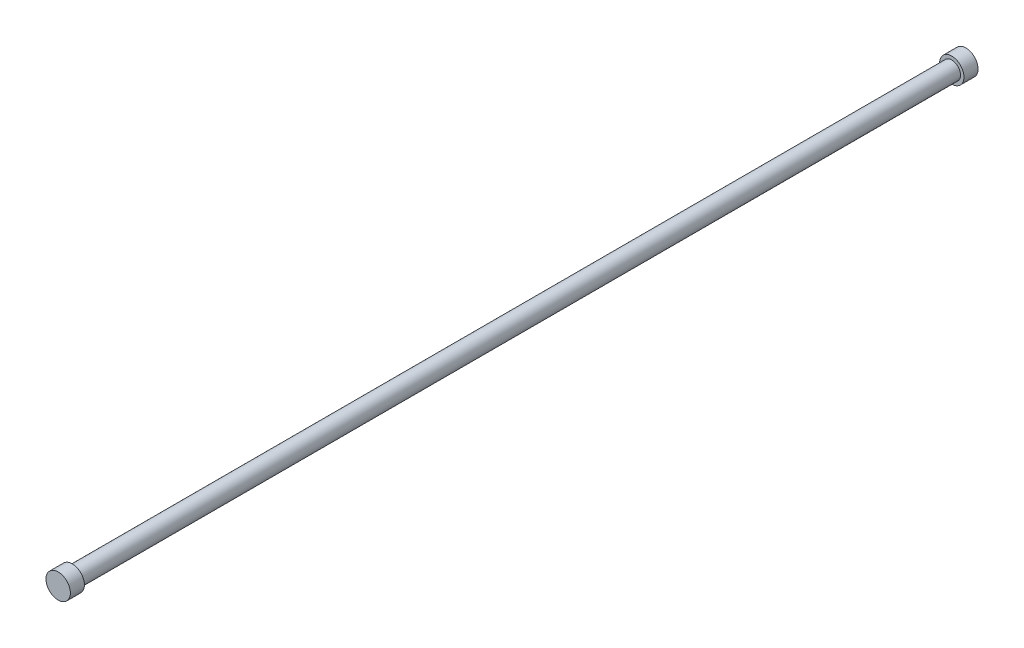
ISO-10303-21;
HEADER;
FILE_DESCRIPTION(('STEP AP214'),'2;1');
FILE_NAME('part.step','',(''),(''),'','','');
FILE_SCHEMA(('AUTOMOTIVE_DESIGN { 1 0 10303 214 1 1 1 1 }'));
ENDSEC;
DATA;
#1=APPLICATION_CONTEXT('core data for automotive mechanical design processes');
#2=APPLICATION_PROTOCOL_DEFINITION('international standard','automotive_design',2000,#1);
#3=PRODUCT_CONTEXT('',#1,'mechanical');
#4=PRODUCT('Part','Part','',(#3));
#5=PRODUCT_RELATED_PRODUCT_CATEGORY('part','',(#4));
#6=PRODUCT_DEFINITION_FORMATION('','',#4);
#7=PRODUCT_DEFINITION_CONTEXT('part definition',#1,'design');
#8=PRODUCT_DEFINITION('design','',#6,#7);
#9=PRODUCT_DEFINITION_SHAPE('','',#8);
#10=(LENGTH_UNIT() NAMED_UNIT(*) SI_UNIT(.MILLI.,.METRE.));
#11=(NAMED_UNIT(*) PLANE_ANGLE_UNIT() SI_UNIT($,.RADIAN.));
#12=(NAMED_UNIT(*) SI_UNIT($,.STERADIAN.) SOLID_ANGLE_UNIT());
#13=UNCERTAINTY_MEASURE_WITH_UNIT(LENGTH_MEASURE(1.E-05),#10,'distance_accuracy_value','');
#14=(GEOMETRIC_REPRESENTATION_CONTEXT(3) GLOBAL_UNCERTAINTY_ASSIGNED_CONTEXT((#13)) GLOBAL_UNIT_ASSIGNED_CONTEXT((#10,
#11,#12)) REPRESENTATION_CONTEXT('',''));
#15=CARTESIAN_POINT('',(0.,0.,0.));
#16=DIRECTION('',(0.,0.,1.));
#17=DIRECTION('',(1.,0.,0.));
#18=AXIS2_PLACEMENT_3D('',#15,#16,#17);
#19=CARTESIAN_POINT('',(0.,0.,317.5));
#20=DIRECTION('',(0.,0.,-1.));
#21=DIRECTION('',(-1.,0.,0.));
#22=AXIS2_PLACEMENT_3D('',#19,#20,#21);
#23=CYLINDRICAL_SURFACE('',#22,3.175);
#24=CARTESIAN_POINT('',(0.,0.,317.5));
#25=DIRECTION('',(0.,0.,1.));
#26=DIRECTION('',(1.,0.,0.));
#27=AXIS2_PLACEMENT_3D('',#24,#25,#26);
#28=CIRCLE('',#27,3.175);
#29=CARTESIAN_POINT('',(-3.175,0.,317.5));
#30=VERTEX_POINT('',#29);
#31=EDGE_CURVE('E10',#30,#30,#28,.T.);
#32=CARTESIAN_POINT('',(0.,0.,0.));
#33=DIRECTION('',(0.,0.,1.));
#34=DIRECTION('',(1.,0.,0.));
#35=AXIS2_PLACEMENT_3D('',#32,#33,#34);
#36=CIRCLE('',#35,3.175);
#37=CARTESIAN_POINT('',(-3.175,0.,0.));
#38=VERTEX_POINT('',#37);
#39=EDGE_CURVE('E46',#38,#38,#36,.T.);
#40=CARTESIAN_POINT('',(-3.175,0.,317.5));
#41=CARTESIAN_POINT('',(-3.175,0.,314.192708333333));
#42=CARTESIAN_POINT('',(-3.175,0.,310.885416666667));
#43=CARTESIAN_POINT('',(-3.175,0.,304.270833333333));
#44=CARTESIAN_POINT('',(-3.175,0.,300.963541666667));
#45=CARTESIAN_POINT('',(-3.175,0.,294.348958333333));
#46=CARTESIAN_POINT('',(-3.175,0.,291.041666666667));
#47=CARTESIAN_POINT('',(-3.175,0.,284.427083333333));
#48=CARTESIAN_POINT('',(-3.175,0.,281.119791666667));
#49=CARTESIAN_POINT('',(-3.175,0.,274.505208333333));
#50=CARTESIAN_POINT('',(-3.175,0.,271.197916666667));
#51=CARTESIAN_POINT('',(-3.175,0.,264.583333333333));
#52=CARTESIAN_POINT('',(-3.175,0.,261.276041666667));
#53=CARTESIAN_POINT('',(-3.175,0.,254.661458333333));
#54=CARTESIAN_POINT('',(-3.175,0.,251.354166666667));
#55=CARTESIAN_POINT('',(-3.175,0.,244.739583333333));
#56=CARTESIAN_POINT('',(-3.175,0.,241.432291666667));
#57=CARTESIAN_POINT('',(-3.175,0.,234.817708333333));
#58=CARTESIAN_POINT('',(-3.175,0.,231.510416666667));
#59=CARTESIAN_POINT('',(-3.175,0.,224.895833333333));
#60=CARTESIAN_POINT('',(-3.175,0.,221.588541666667));
#61=CARTESIAN_POINT('',(-3.175,0.,214.973958333333));
#62=CARTESIAN_POINT('',(-3.175,0.,211.666666666667));
#63=CARTESIAN_POINT('',(-3.175,0.,205.052083333333));
#64=CARTESIAN_POINT('',(-3.175,0.,201.744791666667));
#65=CARTESIAN_POINT('',(-3.175,0.,195.130208333333));
#66=CARTESIAN_POINT('',(-3.175,0.,191.822916666667));
#67=CARTESIAN_POINT('',(-3.175,0.,185.208333333333));
#68=CARTESIAN_POINT('',(-3.175,0.,181.901041666667));
#69=CARTESIAN_POINT('',(-3.175,0.,175.286458333333));
#70=CARTESIAN_POINT('',(-3.175,0.,171.979166666667));
#71=CARTESIAN_POINT('',(-3.175,0.,165.364583333333));
#72=CARTESIAN_POINT('',(-3.175,0.,162.057291666667));
#73=CARTESIAN_POINT('',(-3.175,0.,155.442708333333));
#74=CARTESIAN_POINT('',(-3.175,0.,152.135416666667));
#75=CARTESIAN_POINT('',(-3.175,0.,145.520833333333));
#76=CARTESIAN_POINT('',(-3.175,0.,142.213541666667));
#77=CARTESIAN_POINT('',(-3.175,0.,135.598958333333));
#78=CARTESIAN_POINT('',(-3.175,0.,132.291666666667));
#79=CARTESIAN_POINT('',(-3.175,0.,125.677083333333));
#80=CARTESIAN_POINT('',(-3.175,0.,122.369791666667));
#81=CARTESIAN_POINT('',(-3.175,0.,115.755208333333));
#82=CARTESIAN_POINT('',(-3.175,0.,112.447916666667));
#83=CARTESIAN_POINT('',(-3.175,0.,105.833333333333));
#84=CARTESIAN_POINT('',(-3.175,0.,102.526041666667));
#85=CARTESIAN_POINT('',(-3.175,0.,95.9114583333332));
#86=CARTESIAN_POINT('',(-3.175,0.,92.6041666666666));
#87=CARTESIAN_POINT('',(-3.175,0.,85.9895833333332));
#88=CARTESIAN_POINT('',(-3.175,0.,82.6822916666666));
#89=CARTESIAN_POINT('',(-3.175,0.,76.0677083333332));
#90=CARTESIAN_POINT('',(-3.175,0.,72.7604166666666));
#91=CARTESIAN_POINT('',(-3.175,0.,66.1458333333333));
#92=CARTESIAN_POINT('',(-3.175,0.,62.8385416666666));
#93=CARTESIAN_POINT('',(-3.175,0.,56.2239583333333));
#94=CARTESIAN_POINT('',(-3.175,0.,52.9166666666666));
#95=CARTESIAN_POINT('',(-3.175,0.,46.3020833333333));
#96=CARTESIAN_POINT('',(-3.175,0.,42.9947916666666));
#97=CARTESIAN_POINT('',(-3.175,0.,36.3802083333333));
#98=CARTESIAN_POINT('',(-3.175,0.,33.0729166666666));
#99=CARTESIAN_POINT('',(-3.175,0.,26.4583333333333));
#100=CARTESIAN_POINT('',(-3.175,0.,23.1510416666666));
#101=CARTESIAN_POINT('',(-3.175,0.,16.5364583333333));
#102=CARTESIAN_POINT('',(-3.175,0.,13.2291666666666));
#103=CARTESIAN_POINT('',(-3.175,0.,6.61458333333329));
#104=CARTESIAN_POINT('',(-3.175,0.,3.30729166666662));
#105=CARTESIAN_POINT('',(-3.175,0.,0.));
#106=B_SPLINE_CURVE_WITH_KNOTS('',3,(#40,#41,#42,#43,#44,#45,#46,#47,#48,#49,#50,#51,#52,#53,
#54,#55,#56,#57,#58,#59,#60,#61,#62,#63,#64,#65,#66,#67,#68,#69,#70,#71,#72,#73,#74,#75,#76,#77,
#78,#79,#80,#81,#82,#83,#84,#85,#86,#87,#88,#89,#90,#91,#92,#93,#94,#95,#96,#97,#98,#99,#100,
#101,#102,#103,#104,#105),.UNSPECIFIED.,.F.,.F.,(4,2,2,2,2,2,2,2,2,2,2,2,2,2,2,2,2,2,2,2,2,2,2,
2,2,2,2,2,2,2,2,2,4),(0.,9.92187500000002,19.84375,29.765625,39.6875,49.6093750000001,59.53125,
69.4531250000001,79.375,89.2968750000001,99.2187500000001,109.140625,119.0625,128.984375,
138.90625,148.828125,158.75,168.671875,178.59375,188.515625,198.4375,208.359375,218.28125,
228.203125,238.125,248.046875,257.96875,267.890625,277.8125,287.734375,297.65625,307.578125,
317.5),.UNSPECIFIED.);
#107=EDGE_CURVE('BSEAM43',#30,#38,#106,.T.);
#108=ORIENTED_EDGE('',*,*,#31,.F.);
#109=ORIENTED_EDGE('',*,*,#39,.T.);
#110=ORIENTED_EDGE('',*,*,#107,.T.);
#111=ORIENTED_EDGE('',*,*,#107,.F.);
#112=EDGE_LOOP('',(#108,#110,#109,#111));
#113=FACE_BOUND('',#112,.T.);
#114=ADVANCED_FACE('F43',(#113),#23,.T.);
#115=CARTESIAN_POINT('',(0.,0.,-5.08));
#116=DIRECTION('',(0.,0.,1.));
#117=DIRECTION('',(1.,0.,0.));
#118=AXIS2_PLACEMENT_3D('',#115,#116,#117);
#119=CYLINDRICAL_SURFACE('',#118,4.40166822361238);
#120=CARTESIAN_POINT('',(0.,0.,-5.08));
#121=DIRECTION('',(0.,0.,-1.));
#122=DIRECTION('',(-1.,0.,0.));
#123=AXIS2_PLACEMENT_3D('',#120,#121,#122);
#124=CIRCLE('',#123,4.40166822361238);
#125=CARTESIAN_POINT('',(-4.40166822361238,0.,-5.08));
#126=VERTEX_POINT('',#125);
#127=EDGE_CURVE('E55',#126,#126,#124,.T.);
#128=ORIENTED_EDGE('',*,*,#127,.F.);
#129=EDGE_LOOP('',(#128));
#130=FACE_BOUND('',#129,.T.);
#131=CARTESIAN_POINT('',(0.,0.,0.));
#132=DIRECTION('',(0.,0.,-1.));
#133=DIRECTION('',(-1.,0.,0.));
#134=AXIS2_PLACEMENT_3D('',#131,#132,#133);
#135=CIRCLE('',#134,4.40166822361238);
#136=CARTESIAN_POINT('',(-4.40166822361238,0.,0.));
#137=VERTEX_POINT('',#136);
#138=EDGE_CURVE('E57',#137,#137,#135,.T.);
#139=ORIENTED_EDGE('',*,*,#138,.T.);
#140=EDGE_LOOP('',(#139));
#141=FACE_BOUND('',#140,.T.);
#142=ADVANCED_FACE('F90',(#130,#141),#119,.T.);
#143=CARTESIAN_POINT('',(0.,0.,-5.08));
#144=DIRECTION('',(0.,0.,-1.));
#145=DIRECTION('',(-1.,0.,0.));
#146=AXIS2_PLACEMENT_3D('',#143,#144,#145);
#147=PLANE('',#146);
#148=ORIENTED_EDGE('',*,*,#127,.T.);
#149=EDGE_LOOP('',(#148));
#150=FACE_BOUND('',#149,.T.);
#151=ADVANCED_FACE('F95',(#150),#147,.T.);
#152=CARTESIAN_POINT('',(0.,0.,0.));
#153=DIRECTION('',(0.,0.,-1.));
#154=DIRECTION('',(-1.,0.,0.));
#155=AXIS2_PLACEMENT_3D('',#152,#153,#154);
#156=PLANE('',#155);
#157=ORIENTED_EDGE('',*,*,#39,.F.);
#158=EDGE_LOOP('',(#157));
#159=FACE_BOUND('',#158,.T.);
#160=ORIENTED_EDGE('',*,*,#138,.F.);
#161=EDGE_LOOP('',(#160));
#162=FACE_BOUND('',#161,.T.);
#163=ADVANCED_FACE('F78',(#159,#162),#156,.F.);
#164=CARTESIAN_POINT('',(0.,0.,322.58));
#165=DIRECTION('',(0.,0.,-1.));
#166=DIRECTION('',(-1.,0.,0.));
#167=AXIS2_PLACEMENT_3D('',#164,#165,#166);
#168=CYLINDRICAL_SURFACE('',#167,4.40166822361238);
#169=CARTESIAN_POINT('',(0.,0.,322.58));
#170=DIRECTION('',(0.,0.,1.));
#171=DIRECTION('',(1.,0.,0.));
#172=AXIS2_PLACEMENT_3D('',#169,#170,#171);
#173=CIRCLE('',#172,4.40166822361238);
#174=CARTESIAN_POINT('',(4.40166822361238,0.,322.58));
#175=VERTEX_POINT('',#174);
#176=EDGE_CURVE('E61',#175,#175,#173,.T.);
#177=ORIENTED_EDGE('',*,*,#176,.F.);
#178=EDGE_LOOP('',(#177));
#179=FACE_BOUND('',#178,.T.);
#180=CARTESIAN_POINT('',(0.,0.,317.5));
#181=DIRECTION('',(0.,0.,1.));
#182=DIRECTION('',(1.,0.,0.));
#183=AXIS2_PLACEMENT_3D('',#180,#181,#182);
#184=CIRCLE('',#183,4.40166822361238);
#185=CARTESIAN_POINT('',(4.40166822361238,0.,317.5));
#186=VERTEX_POINT('',#185);
#187=EDGE_CURVE('E65',#186,#186,#184,.T.);
#188=ORIENTED_EDGE('',*,*,#187,.T.);
#189=EDGE_LOOP('',(#188));
#190=FACE_BOUND('',#189,.T.);
#191=ADVANCED_FACE('F75',(#179,#190),#168,.T.);
#192=CARTESIAN_POINT('',(0.,0.,322.58));
#193=DIRECTION('',(0.,0.,1.));
#194=DIRECTION('',(1.,0.,0.));
#195=AXIS2_PLACEMENT_3D('',#192,#193,#194);
#196=PLANE('',#195);
#197=ORIENTED_EDGE('',*,*,#176,.T.);
#198=EDGE_LOOP('',(#197));
#199=FACE_BOUND('',#198,.T.);
#200=ADVANCED_FACE('F73',(#199),#196,.T.);
#201=CARTESIAN_POINT('',(0.,0.,317.5));
#202=DIRECTION('',(0.,0.,1.));
#203=DIRECTION('',(1.,0.,0.));
#204=AXIS2_PLACEMENT_3D('',#201,#202,#203);
#205=PLANE('',#204);
#206=ORIENTED_EDGE('',*,*,#31,.T.);
#207=EDGE_LOOP('',(#206));
#208=FACE_BOUND('',#207,.T.);
#209=ORIENTED_EDGE('',*,*,#187,.F.);
#210=EDGE_LOOP('',(#209));
#211=FACE_BOUND('',#210,.T.);
#212=ADVANCED_FACE('F82',(#208,#211),#205,.F.);
#213=CLOSED_SHELL('',(#114,#142,#151,#163,#191,#200,#212));
#214=MANIFOLD_SOLID_BREP('B2',#213);
#215=ADVANCED_BREP_SHAPE_REPRESENTATION('',(#18,#214),#14);
#216=SHAPE_DEFINITION_REPRESENTATION(#9,#215);
ENDSEC;
END-ISO-10303-21;
